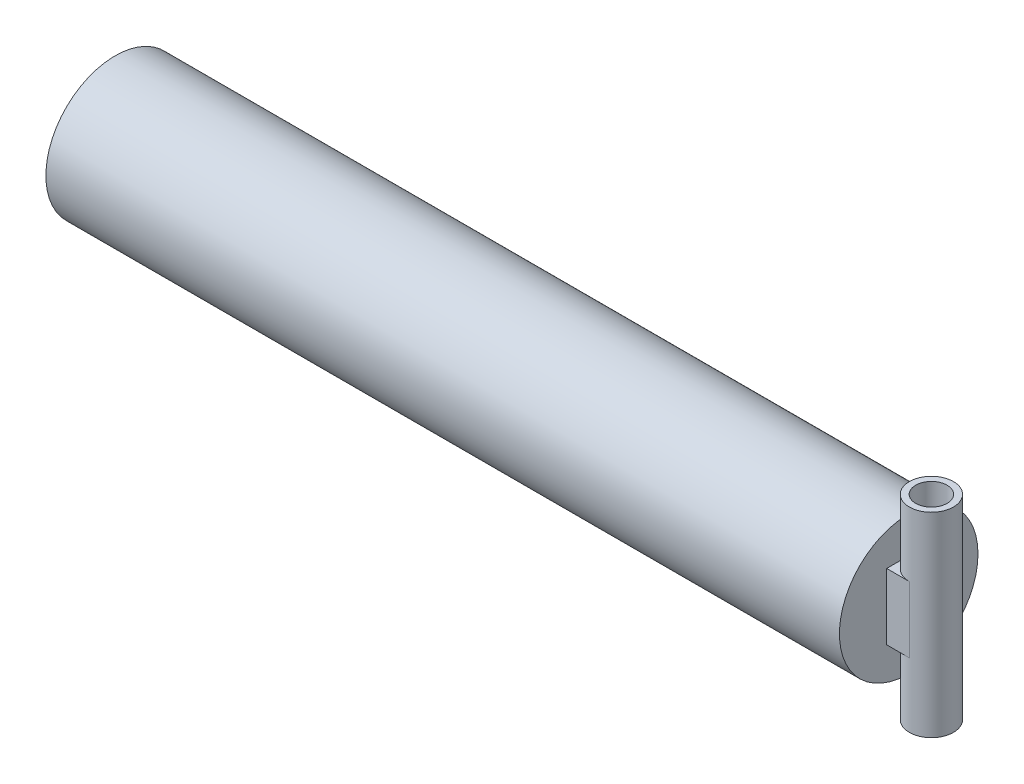
ISO-10303-21;
HEADER;
FILE_DESCRIPTION(('STEP AP214'),'2;1');
FILE_NAME('part.step','',(''),(''),'','','');
FILE_SCHEMA(('AUTOMOTIVE_DESIGN { 1 0 10303 214 1 1 1 1 }'));
ENDSEC;
DATA;
#1=APPLICATION_CONTEXT('core data for automotive mechanical design processes');
#2=APPLICATION_PROTOCOL_DEFINITION('international standard','automotive_design',2000,#1);
#3=PRODUCT_CONTEXT('',#1,'mechanical');
#4=PRODUCT('Part','Part','',(#3));
#5=PRODUCT_RELATED_PRODUCT_CATEGORY('part','',(#4));
#6=PRODUCT_DEFINITION_FORMATION('','',#4);
#7=PRODUCT_DEFINITION_CONTEXT('part definition',#1,'design');
#8=PRODUCT_DEFINITION('design','',#6,#7);
#9=PRODUCT_DEFINITION_SHAPE('','',#8);
#10=(LENGTH_UNIT() NAMED_UNIT(*) SI_UNIT(.MILLI.,.METRE.));
#11=(NAMED_UNIT(*) PLANE_ANGLE_UNIT() SI_UNIT($,.RADIAN.));
#12=(NAMED_UNIT(*) SI_UNIT($,.STERADIAN.) SOLID_ANGLE_UNIT());
#13=UNCERTAINTY_MEASURE_WITH_UNIT(LENGTH_MEASURE(1.E-05),#10,'distance_accuracy_value','');
#14=(GEOMETRIC_REPRESENTATION_CONTEXT(3) GLOBAL_UNCERTAINTY_ASSIGNED_CONTEXT((#13)) GLOBAL_UNIT_ASSIGNED_CONTEXT((#10,
#11,#12)) REPRESENTATION_CONTEXT('',''));
#15=CARTESIAN_POINT('',(0.,0.,0.));
#16=DIRECTION('',(0.,0.,1.));
#17=DIRECTION('',(1.,0.,0.));
#18=AXIS2_PLACEMENT_3D('',#15,#16,#17);
#19=CARTESIAN_POINT('',(630.,0.,0.));
#20=DIRECTION('',(-1.,0.,0.));
#21=DIRECTION('',(0.,0.,1.));
#22=AXIS2_PLACEMENT_3D('',#19,#20,#21);
#23=PLANE('',#22);
#24=CARTESIAN_POINT('',(630.,0.,0.));
#25=DIRECTION('',(1.,0.,0.));
#26=DIRECTION('',(0.,0.,-1.));
#27=AXIS2_PLACEMENT_3D('',#24,#25,#26);
#28=CIRCLE('',#27,110.);
#29=CARTESIAN_POINT('',(630.,0.,-110.));
#30=VERTEX_POINT('',#29);
#31=EDGE_CURVE('E106',#30,#30,#28,.T.);
#32=ORIENTED_EDGE('',*,*,#31,.T.);
#33=EDGE_LOOP('',(#32));
#34=FACE_BOUND('',#33,.T.);
#35=DIRECTION('',(0.,0.,1.));
#36=VECTOR('',#35,1.);
#37=CARTESIAN_POINT('',(630.,52.5,-35.));
#38=LINE('',#37,#36);
#39=CARTESIAN_POINT('',(630.,52.5,-35.));
#40=VERTEX_POINT('',#39);
#41=CARTESIAN_POINT('',(630.,52.5,35.));
#42=VERTEX_POINT('',#41);
#43=EDGE_CURVE('E54',#40,#42,#38,.T.);
#44=ORIENTED_EDGE('',*,*,#43,.F.);
#45=DIRECTION('',(0.,1.,0.));
#46=VECTOR('',#45,1.);
#47=CARTESIAN_POINT('',(630.,52.5,-35.));
#48=LINE('',#47,#46);
#49=CARTESIAN_POINT('',(630.,-52.5,-35.));
#50=VERTEX_POINT('',#49);
#51=EDGE_CURVE('E59',#50,#40,#48,.T.);
#52=ORIENTED_EDGE('',*,*,#51,.F.);
#53=DIRECTION('',(0.,0.,-1.));
#54=VECTOR('',#53,1.);
#55=CARTESIAN_POINT('',(630.,-52.5,-35.));
#56=LINE('',#55,#54);
#57=CARTESIAN_POINT('',(630.,-52.5,35.));
#58=VERTEX_POINT('',#57);
#59=EDGE_CURVE('E185',#58,#50,#56,.T.);
#60=ORIENTED_EDGE('',*,*,#59,.F.);
#61=DIRECTION('',(0.,-1.,0.));
#62=VECTOR('',#61,1.);
#63=CARTESIAN_POINT('',(630.,52.5,35.));
#64=LINE('',#63,#62);
#65=EDGE_CURVE('E188',#42,#58,#64,.T.);
#66=ORIENTED_EDGE('',*,*,#65,.F.);
#67=EDGE_LOOP('',(#44,#52,#60,#66));
#68=FACE_BOUND('',#67,.T.);
#69=ADVANCED_FACE('F39',(#34,#68),#23,.F.);
#70=CARTESIAN_POINT('',(-630.,0.,0.));
#71=DIRECTION('',(1.,0.,0.));
#72=DIRECTION('',(0.,0.,-1.));
#73=AXIS2_PLACEMENT_3D('',#70,#71,#72);
#74=PLANE('',#73);
#75=CARTESIAN_POINT('',(-630.,0.,0.));
#76=DIRECTION('',(1.,0.,0.));
#77=DIRECTION('',(0.,0.,-1.));
#78=AXIS2_PLACEMENT_3D('',#75,#76,#77);
#79=CIRCLE('',#78,110.);
#80=CARTESIAN_POINT('',(-630.,0.,-110.));
#81=VERTEX_POINT('',#80);
#82=EDGE_CURVE('E109',#81,#81,#79,.T.);
#83=ORIENTED_EDGE('',*,*,#82,.F.);
#84=EDGE_LOOP('',(#83));
#85=FACE_BOUND('',#84,.T.);
#86=CARTESIAN_POINT('',(-630.,0.,0.));
#87=DIRECTION('',(-1.,0.,0.));
#88=DIRECTION('',(0.,0.,1.));
#89=AXIS2_PLACEMENT_3D('',#86,#87,#88);
#90=CIRCLE('',#89,25.);
#91=CARTESIAN_POINT('',(-630.,0.,25.));
#92=VERTEX_POINT('',#91);
#93=EDGE_CURVE('E177',#92,#92,#90,.T.);
#94=ORIENTED_EDGE('',*,*,#93,.F.);
#95=EDGE_LOOP('',(#94));
#96=FACE_BOUND('',#95,.T.);
#97=ADVANCED_FACE('F41',(#85,#96),#74,.F.);
#98=CARTESIAN_POINT('',(-630.,0.,0.));
#99=DIRECTION('',(-1.,0.,0.));
#100=DIRECTION('',(0.,0.,1.));
#101=AXIS2_PLACEMENT_3D('',#98,#99,#100);
#102=CYLINDRICAL_SURFACE('',#101,110.);
#103=ORIENTED_EDGE('',*,*,#82,.T.);
#104=EDGE_LOOP('',(#103));
#105=FACE_BOUND('',#104,.T.);
#106=ORIENTED_EDGE('',*,*,#31,.F.);
#107=EDGE_LOOP('',(#106));
#108=FACE_BOUND('',#107,.T.);
#109=ADVANCED_FACE('F145',(#105,#108),#102,.T.);
#110=CARTESIAN_POINT('',(701.002,52.5,35.));
#111=DIRECTION('',(0.,0.,-1.));
#112=DIRECTION('',(-1.,0.,0.));
#113=AXIS2_PLACEMENT_3D('',#110,#111,#112);
#114=PLANE('',#113);
#115=DIRECTION('',(-1.,0.,0.));
#116=VECTOR('',#115,1.);
#117=CARTESIAN_POINT('',(701.002,-52.5,35.));
#118=LINE('',#117,#116);
#119=CARTESIAN_POINT('',(666.,-52.5,35.));
#120=VERTEX_POINT('',#119);
#121=EDGE_CURVE('E195',#120,#58,#118,.T.);
#122=ORIENTED_EDGE('',*,*,#121,.F.);
#123=DIRECTION('',(0.,1.,0.));
#124=VECTOR('',#123,1.);
#125=CARTESIAN_POINT('',(666.,-155.,34.9999999999999));
#126=LINE('',#125,#124);
#127=CARTESIAN_POINT('',(666.,52.5,35.));
#128=VERTEX_POINT('',#127);
#129=EDGE_CURVE('E94',#120,#128,#126,.T.);
#130=ORIENTED_EDGE('',*,*,#129,.T.);
#131=DIRECTION('',(-1.,0.,0.));
#132=VECTOR('',#131,1.);
#133=CARTESIAN_POINT('',(701.002,52.5,35.));
#134=LINE('',#133,#132);
#135=EDGE_CURVE('E91',#128,#42,#134,.T.);
#136=ORIENTED_EDGE('',*,*,#135,.T.);
#137=ORIENTED_EDGE('',*,*,#65,.T.);
#138=EDGE_LOOP('',(#122,#130,#136,#137));
#139=FACE_BOUND('',#138,.T.);
#140=ADVANCED_FACE('F150',(#139),#114,.F.);
#141=CARTESIAN_POINT('',(701.002,52.5,-35.));
#142=DIRECTION('',(0.,-1.,0.));
#143=DIRECTION('',(0.,0.,-1.));
#144=AXIS2_PLACEMENT_3D('',#141,#142,#143);
#145=PLANE('',#144);
#146=ORIENTED_EDGE('',*,*,#135,.F.);
#147=CARTESIAN_POINT('',(666.,52.5,0.));
#148=DIRECTION('',(0.,-1.,0.));
#149=DIRECTION('',(0.,0.,-1.));
#150=AXIS2_PLACEMENT_3D('',#147,#148,#149);
#151=CIRCLE('',#150,34.9999999999999);
#152=CARTESIAN_POINT('',(666.,52.5,-34.9999999999999));
#153=VERTEX_POINT('',#152);
#154=EDGE_CURVE('E88',#128,#153,#151,.T.);
#155=ORIENTED_EDGE('',*,*,#154,.T.);
#156=DIRECTION('',(-1.,0.,0.));
#157=VECTOR('',#156,1.);
#158=CARTESIAN_POINT('',(701.002,52.5,-35.));
#159=LINE('',#158,#157);
#160=EDGE_CURVE('E77',#153,#40,#159,.T.);
#161=ORIENTED_EDGE('',*,*,#160,.T.);
#162=ORIENTED_EDGE('',*,*,#43,.T.);
#163=EDGE_LOOP('',(#146,#155,#161,#162));
#164=FACE_BOUND('',#163,.T.);
#165=ADVANCED_FACE('F89',(#164),#145,.F.);
#166=CARTESIAN_POINT('',(701.002,-52.5,-35.));
#167=DIRECTION('',(0.,1.,0.));
#168=DIRECTION('',(0.,0.,1.));
#169=AXIS2_PLACEMENT_3D('',#166,#167,#168);
#170=PLANE('',#169);
#171=DIRECTION('',(-1.,0.,0.));
#172=VECTOR('',#171,1.);
#173=CARTESIAN_POINT('',(701.002,-52.5,-35.));
#174=LINE('',#173,#172);
#175=CARTESIAN_POINT('',(666.,-52.5,-35.));
#176=VERTEX_POINT('',#175);
#177=EDGE_CURVE('E84',#176,#50,#174,.T.);
#178=ORIENTED_EDGE('',*,*,#177,.F.);
#179=CARTESIAN_POINT('',(666.,-52.5,0.));
#180=DIRECTION('',(0.,1.,0.));
#181=DIRECTION('',(0.,0.,1.));
#182=AXIS2_PLACEMENT_3D('',#179,#180,#181);
#183=CIRCLE('',#182,34.9999999999999);
#184=EDGE_CURVE('E98',#176,#120,#183,.T.);
#185=ORIENTED_EDGE('',*,*,#184,.T.);
#186=ORIENTED_EDGE('',*,*,#121,.T.);
#187=ORIENTED_EDGE('',*,*,#59,.T.);
#188=EDGE_LOOP('',(#178,#185,#186,#187));
#189=FACE_BOUND('',#188,.T.);
#190=ADVANCED_FACE('F200',(#189),#170,.F.);
#191=CARTESIAN_POINT('',(701.002,52.5,-35.));
#192=DIRECTION('',(0.,0.,1.));
#193=DIRECTION('',(1.,0.,0.));
#194=AXIS2_PLACEMENT_3D('',#191,#192,#193);
#195=PLANE('',#194);
#196=DIRECTION('',(0.,1.,0.));
#197=VECTOR('',#196,1.);
#198=CARTESIAN_POINT('',(666.,-155.,-34.9999999999999));
#199=LINE('',#198,#197);
#200=EDGE_CURVE('E81',#176,#153,#199,.T.);
#201=ORIENTED_EDGE('',*,*,#200,.F.);
#202=ORIENTED_EDGE('',*,*,#177,.T.);
#203=ORIENTED_EDGE('',*,*,#51,.T.);
#204=ORIENTED_EDGE('',*,*,#160,.F.);
#205=EDGE_LOOP('',(#201,#202,#203,#204));
#206=FACE_BOUND('',#205,.T.);
#207=ADVANCED_FACE('F79',(#206),#195,.F.);
#208=CARTESIAN_POINT('',(666.,-155.,0.));
#209=DIRECTION('',(0.,1.,0.));
#210=DIRECTION('',(0.,0.,1.));
#211=AXIS2_PLACEMENT_3D('',#208,#209,#210);
#212=CYLINDRICAL_SURFACE('',#211,34.9999999999999);
#213=CARTESIAN_POINT('',(666.,155.,0.));
#214=DIRECTION('',(0.,1.,0.));
#215=DIRECTION('',(0.,0.,1.));
#216=AXIS2_PLACEMENT_3D('',#213,#214,#215);
#217=CIRCLE('',#216,34.9999999999999);
#218=CARTESIAN_POINT('',(666.,155.,34.9999999999999));
#219=VERTEX_POINT('',#218);
#220=EDGE_CURVE('E174',#219,#219,#217,.T.);
#221=ORIENTED_EDGE('',*,*,#220,.F.);
#222=EDGE_LOOP('',(#221));
#223=FACE_BOUND('',#222,.T.);
#224=CARTESIAN_POINT('',(666.,-155.,0.));
#225=DIRECTION('',(0.,1.,0.));
#226=DIRECTION('',(0.,0.,1.));
#227=AXIS2_PLACEMENT_3D('',#224,#225,#226);
#228=CIRCLE('',#227,34.9999999999999);
#229=CARTESIAN_POINT('',(666.,-155.,34.9999999999999));
#230=VERTEX_POINT('',#229);
#231=EDGE_CURVE('E99',#230,#230,#228,.T.);
#232=ORIENTED_EDGE('',*,*,#231,.T.);
#233=EDGE_LOOP('',(#232));
#234=FACE_BOUND('',#233,.T.);
#235=ORIENTED_EDGE('',*,*,#129,.F.);
#236=ORIENTED_EDGE('',*,*,#184,.F.);
#237=ORIENTED_EDGE('',*,*,#200,.T.);
#238=ORIENTED_EDGE('',*,*,#154,.F.);
#239=EDGE_LOOP('',(#235,#236,#237,#238));
#240=FACE_BOUND('',#239,.T.);
#241=ADVANCED_FACE('F97',(#223,#234,#240),#212,.T.);
#242=CARTESIAN_POINT('',(666.,-155.,0.));
#243=DIRECTION('',(0.,1.,0.));
#244=DIRECTION('',(0.,0.,1.));
#245=AXIS2_PLACEMENT_3D('',#242,#243,#244);
#246=PLANE('',#245);
#247=CARTESIAN_POINT('',(666.,-155.,0.));
#248=DIRECTION('',(0.,1.,0.));
#249=DIRECTION('',(0.,0.,1.));
#250=AXIS2_PLACEMENT_3D('',#247,#248,#249);
#251=CIRCLE('',#250,25.);
#252=CARTESIAN_POINT('',(666.,-155.,25.));
#253=VERTEX_POINT('',#252);
#254=EDGE_CURVE('E102',#253,#253,#251,.T.);
#255=ORIENTED_EDGE('',*,*,#254,.T.);
#256=EDGE_LOOP('',(#255));
#257=FACE_BOUND('',#256,.T.);
#258=ORIENTED_EDGE('',*,*,#231,.F.);
#259=EDGE_LOOP('',(#258));
#260=FACE_BOUND('',#259,.T.);
#261=ADVANCED_FACE('F239',(#257,#260),#246,.F.);
#262=CARTESIAN_POINT('',(666.,-155.,0.));
#263=DIRECTION('',(0.,1.,0.));
#264=DIRECTION('',(0.,0.,1.));
#265=AXIS2_PLACEMENT_3D('',#262,#263,#264);
#266=CYLINDRICAL_SURFACE('',#265,25.);
#267=ORIENTED_EDGE('',*,*,#254,.F.);
#268=EDGE_LOOP('',(#267));
#269=FACE_BOUND('',#268,.T.);
#270=CARTESIAN_POINT('',(666.,155.,0.));
#271=DIRECTION('',(0.,1.,0.));
#272=DIRECTION('',(0.,0.,1.));
#273=AXIS2_PLACEMENT_3D('',#270,#271,#272);
#274=CIRCLE('',#273,25.);
#275=CARTESIAN_POINT('',(666.,155.,25.));
#276=VERTEX_POINT('',#275);
#277=EDGE_CURVE('E170',#276,#276,#274,.T.);
#278=ORIENTED_EDGE('',*,*,#277,.T.);
#279=EDGE_LOOP('',(#278));
#280=FACE_BOUND('',#279,.T.);
#281=ADVANCED_FACE('F236',(#269,#280),#266,.F.);
#282=CARTESIAN_POINT('',(666.,155.,0.));
#283=DIRECTION('',(0.,1.,0.));
#284=DIRECTION('',(0.,0.,1.));
#285=AXIS2_PLACEMENT_3D('',#282,#283,#284);
#286=PLANE('',#285);
#287=ORIENTED_EDGE('',*,*,#220,.T.);
#288=EDGE_LOOP('',(#287));
#289=FACE_BOUND('',#288,.T.);
#290=ORIENTED_EDGE('',*,*,#277,.F.);
#291=EDGE_LOOP('',(#290));
#292=FACE_BOUND('',#291,.T.);
#293=ADVANCED_FACE('F228',(#289,#292),#286,.T.);
#294=CARTESIAN_POINT('',(-620.,0.,0.));
#295=DIRECTION('',(-1.,0.,0.));
#296=DIRECTION('',(0.,0.,1.));
#297=AXIS2_PLACEMENT_3D('',#294,#295,#296);
#298=PLANE('',#297);
#299=CARTESIAN_POINT('',(-620.,0.,0.));
#300=DIRECTION('',(-1.,0.,0.));
#301=DIRECTION('',(0.,0.,1.));
#302=AXIS2_PLACEMENT_3D('',#299,#300,#301);
#303=CIRCLE('',#302,25.);
#304=CARTESIAN_POINT('',(-620.,0.,25.));
#305=VERTEX_POINT('',#304);
#306=EDGE_CURVE('E171',#305,#305,#303,.T.);
#307=ORIENTED_EDGE('',*,*,#306,.T.);
#308=EDGE_LOOP('',(#307));
#309=FACE_BOUND('',#308,.T.);
#310=CARTESIAN_POINT('',(-620.,0.,0.));
#311=DIRECTION('',(-1.,0.,0.));
#312=DIRECTION('',(0.,0.,1.));
#313=AXIS2_PLACEMENT_3D('',#310,#311,#312);
#314=CIRCLE('',#313,90.);
#315=CARTESIAN_POINT('',(-620.,0.,90.));
#316=VERTEX_POINT('',#315);
#317=EDGE_CURVE('E168',#316,#316,#314,.T.);
#318=ORIENTED_EDGE('',*,*,#317,.F.);
#319=EDGE_LOOP('',(#318));
#320=FACE_BOUND('',#319,.T.);
#321=ADVANCED_FACE('F221',(#309,#320),#298,.F.);
#322=CARTESIAN_POINT('',(-620.,0.,0.));
#323=DIRECTION('',(-1.,0.,0.));
#324=DIRECTION('',(0.,0.,1.));
#325=AXIS2_PLACEMENT_3D('',#322,#323,#324);
#326=CYLINDRICAL_SURFACE('',#325,25.);
#327=ORIENTED_EDGE('',*,*,#306,.F.);
#328=EDGE_LOOP('',(#327));
#329=FACE_BOUND('',#328,.T.);
#330=ORIENTED_EDGE('',*,*,#93,.T.);
#331=EDGE_LOOP('',(#330));
#332=FACE_BOUND('',#331,.T.);
#333=ADVANCED_FACE('F216',(#329,#332),#326,.F.);
#334=CARTESIAN_POINT('',(620.,0.,0.));
#335=DIRECTION('',(-1.,0.,0.));
#336=DIRECTION('',(0.,0.,1.));
#337=AXIS2_PLACEMENT_3D('',#334,#335,#336);
#338=PLANE('',#337);
#339=CARTESIAN_POINT('',(620.,0.,0.));
#340=DIRECTION('',(-1.,0.,0.));
#341=DIRECTION('',(0.,0.,1.));
#342=AXIS2_PLACEMENT_3D('',#339,#340,#341);
#343=CIRCLE('',#342,90.);
#344=CARTESIAN_POINT('',(620.,0.,90.));
#345=VERTEX_POINT('',#344);
#346=EDGE_CURVE('E11',#345,#345,#343,.T.);
#347=ORIENTED_EDGE('',*,*,#346,.T.);
#348=EDGE_LOOP('',(#347));
#349=FACE_BOUND('',#348,.T.);
#350=ADVANCED_FACE('F138',(#349),#338,.T.);
#351=CARTESIAN_POINT('',(-630.,0.,0.));
#352=DIRECTION('',(-1.,0.,0.));
#353=DIRECTION('',(0.,0.,1.));
#354=AXIS2_PLACEMENT_3D('',#351,#352,#353);
#355=CYLINDRICAL_SURFACE('',#354,90.);
#356=CARTESIAN_POINT('',(590.,0.,0.));
#357=DIRECTION('',(-1.,0.,0.));
#358=DIRECTION('',(0.,0.,1.));
#359=AXIS2_PLACEMENT_3D('',#356,#357,#358);
#360=CIRCLE('',#359,90.);
#361=CARTESIAN_POINT('',(590.,0.,90.));
#362=VERTEX_POINT('',#361);
#363=EDGE_CURVE('E47',#362,#362,#360,.T.);
#364=ORIENTED_EDGE('',*,*,#363,.T.);
#365=EDGE_LOOP('',(#364));
#366=FACE_BOUND('',#365,.T.);
#367=ORIENTED_EDGE('',*,*,#346,.F.);
#368=EDGE_LOOP('',(#367));
#369=FACE_BOUND('',#368,.T.);
#370=ADVANCED_FACE('F123',(#366,#369),#355,.F.);
#371=CARTESIAN_POINT('',(590.,0.,0.));
#372=DIRECTION('',(-1.,0.,0.));
#373=DIRECTION('',(0.,0.,1.));
#374=AXIS2_PLACEMENT_3D('',#371,#372,#373);
#375=PLANE('',#374);
#376=CARTESIAN_POINT('',(590.,0.,0.));
#377=DIRECTION('',(-1.,0.,0.));
#378=DIRECTION('',(0.,0.,1.));
#379=AXIS2_PLACEMENT_3D('',#376,#377,#378);
#380=CIRCLE('',#379,99.9999999999999);
#381=CARTESIAN_POINT('',(590.,0.,99.9999999999999));
#382=VERTEX_POINT('',#381);
#383=EDGE_CURVE('E118',#382,#382,#380,.T.);
#384=ORIENTED_EDGE('',*,*,#383,.T.);
#385=EDGE_LOOP('',(#384));
#386=FACE_BOUND('',#385,.T.);
#387=ORIENTED_EDGE('',*,*,#363,.F.);
#388=EDGE_LOOP('',(#387));
#389=FACE_BOUND('',#388,.T.);
#390=ADVANCED_FACE('F126',(#386,#389),#375,.T.);
#391=CARTESIAN_POINT('',(-630.,0.,0.));
#392=DIRECTION('',(-1.,0.,0.));
#393=DIRECTION('',(0.,0.,1.));
#394=AXIS2_PLACEMENT_3D('',#391,#392,#393);
#395=CYLINDRICAL_SURFACE('',#394,99.9999999999999);
#396=CARTESIAN_POINT('',(-590.,0.,0.));
#397=DIRECTION('',(1.,0.,0.));
#398=DIRECTION('',(0.,0.,-1.));
#399=AXIS2_PLACEMENT_3D('',#396,#397,#398);
#400=CIRCLE('',#399,99.9999999999999);
#401=CARTESIAN_POINT('',(-590.,0.,-99.9999999999999));
#402=VERTEX_POINT('',#401);
#403=EDGE_CURVE('E115',#402,#402,#400,.F.);
#404=ORIENTED_EDGE('',*,*,#403,.T.);
#405=EDGE_LOOP('',(#404));
#406=FACE_BOUND('',#405,.T.);
#407=ORIENTED_EDGE('',*,*,#383,.F.);
#408=EDGE_LOOP('',(#407));
#409=FACE_BOUND('',#408,.T.);
#410=ADVANCED_FACE('F128',(#406,#409),#395,.F.);
#411=CARTESIAN_POINT('',(-590.,0.,0.));
#412=DIRECTION('',(1.,0.,0.));
#413=DIRECTION('',(0.,0.,-1.));
#414=AXIS2_PLACEMENT_3D('',#411,#412,#413);
#415=PLANE('',#414);
#416=CARTESIAN_POINT('',(-590.,0.,0.));
#417=DIRECTION('',(1.,0.,0.));
#418=DIRECTION('',(0.,0.,-1.));
#419=AXIS2_PLACEMENT_3D('',#416,#417,#418);
#420=CIRCLE('',#419,90.);
#421=CARTESIAN_POINT('',(-590.,0.,-90.));
#422=VERTEX_POINT('',#421);
#423=EDGE_CURVE('E112',#422,#422,#420,.F.);
#424=ORIENTED_EDGE('',*,*,#423,.T.);
#425=EDGE_LOOP('',(#424));
#426=FACE_BOUND('',#425,.T.);
#427=ORIENTED_EDGE('',*,*,#403,.F.);
#428=EDGE_LOOP('',(#427));
#429=FACE_BOUND('',#428,.T.);
#430=ADVANCED_FACE('F135',(#426,#429),#415,.T.);
#431=CARTESIAN_POINT('',(-630.,0.,0.));
#432=DIRECTION('',(-1.,0.,0.));
#433=DIRECTION('',(0.,0.,1.));
#434=AXIS2_PLACEMENT_3D('',#431,#432,#433);
#435=CYLINDRICAL_SURFACE('',#434,90.);
#436=ORIENTED_EDGE('',*,*,#423,.F.);
#437=EDGE_LOOP('',(#436));
#438=FACE_BOUND('',#437,.T.);
#439=ORIENTED_EDGE('',*,*,#317,.T.);
#440=EDGE_LOOP('',(#439));
#441=FACE_BOUND('',#440,.T.);
#442=ADVANCED_FACE('F153',(#438,#441),#435,.F.);
#443=CLOSED_SHELL('',(#69,#97,#109,#140,#165,#190,#207,#241,#261,#281,#293,#321,#333,#350,#370,
#390,#410,#430,#442));
#444=MANIFOLD_SOLID_BREP('B2',#443);
#445=ADVANCED_BREP_SHAPE_REPRESENTATION('',(#18,#444),#14);
#446=SHAPE_DEFINITION_REPRESENTATION(#9,#445);
ENDSEC;
END-ISO-10303-21;
